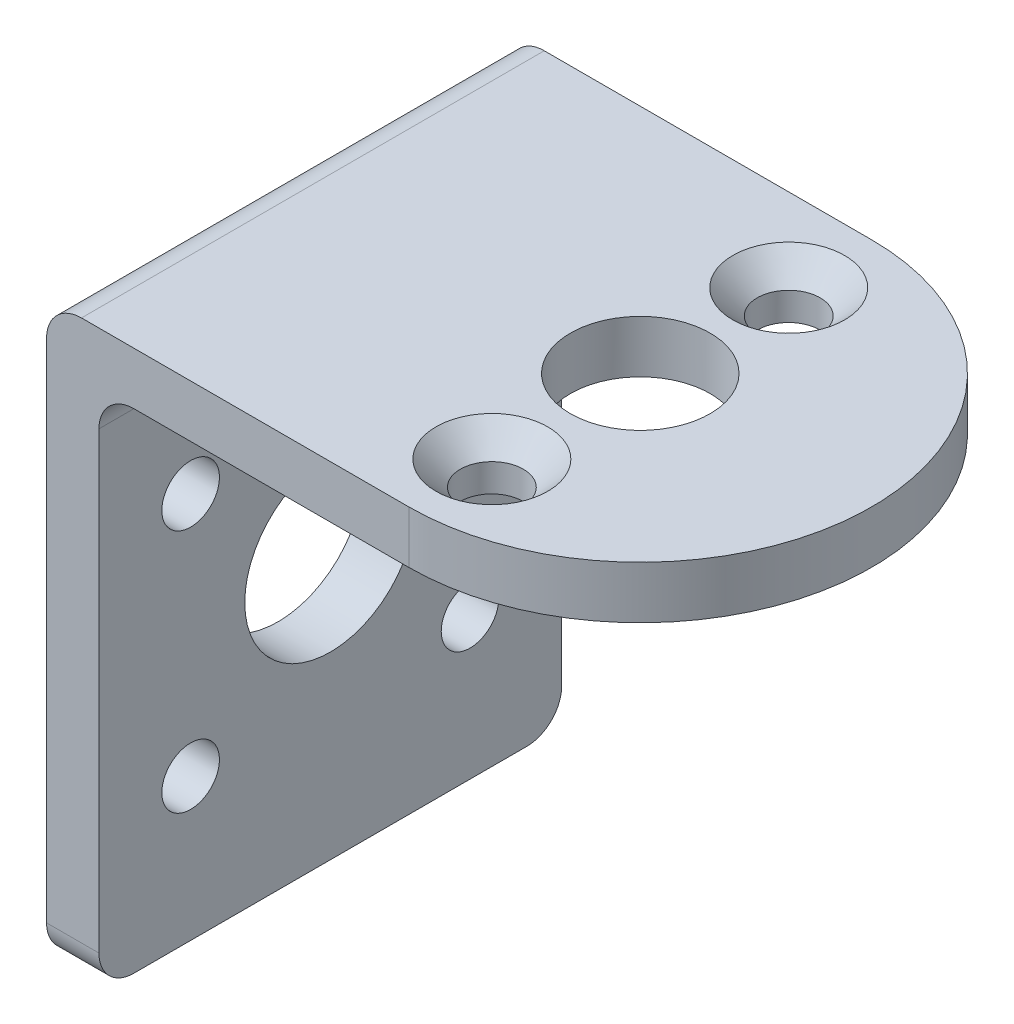
ISO-10303-21;
HEADER;
FILE_DESCRIPTION(('STEP AP214'),'2;1');
FILE_NAME('part.step','',(''),(''),'','','');
FILE_SCHEMA(('AUTOMOTIVE_DESIGN { 1 0 10303 214 1 1 1 1 }'));
ENDSEC;
DATA;
#1=APPLICATION_CONTEXT('core data for automotive mechanical design processes');
#2=APPLICATION_PROTOCOL_DEFINITION('international standard','automotive_design',2000,#1);
#3=PRODUCT_CONTEXT('',#1,'mechanical');
#4=PRODUCT('Part','Part','',(#3));
#5=PRODUCT_RELATED_PRODUCT_CATEGORY('part','',(#4));
#6=PRODUCT_DEFINITION_FORMATION('','',#4);
#7=PRODUCT_DEFINITION_CONTEXT('part definition',#1,'design');
#8=PRODUCT_DEFINITION('design','',#6,#7);
#9=PRODUCT_DEFINITION_SHAPE('','',#8);
#10=(LENGTH_UNIT() NAMED_UNIT(*) SI_UNIT(.MILLI.,.METRE.));
#11=(NAMED_UNIT(*) PLANE_ANGLE_UNIT() SI_UNIT($,.RADIAN.));
#12=(NAMED_UNIT(*) SI_UNIT($,.STERADIAN.) SOLID_ANGLE_UNIT());
#13=UNCERTAINTY_MEASURE_WITH_UNIT(LENGTH_MEASURE(1.E-05),#10,'distance_accuracy_value','');
#14=(GEOMETRIC_REPRESENTATION_CONTEXT(3) GLOBAL_UNCERTAINTY_ASSIGNED_CONTEXT((#13)) GLOBAL_UNIT_ASSIGNED_CONTEXT((#10,
#11,#12)) REPRESENTATION_CONTEXT('',''));
#15=CARTESIAN_POINT('',(0.,0.,0.));
#16=DIRECTION('',(0.,0.,1.));
#17=DIRECTION('',(1.,0.,0.));
#18=AXIS2_PLACEMENT_3D('',#15,#16,#17);
#19=CARTESIAN_POINT('',(5.,-5.,13.25));
#20=DIRECTION('',(0.,0.,-1.));
#21=DIRECTION('',(-1.,0.,0.));
#22=AXIS2_PLACEMENT_3D('',#19,#20,#21);
#23=CYLINDRICAL_SURFACE('',#22,2.);
#24=CARTESIAN_POINT('',(5.,-5.,-13.25));
#25=DIRECTION('',(0.,0.,-1.));
#26=DIRECTION('',(-1.,0.,0.));
#27=AXIS2_PLACEMENT_3D('',#24,#25,#26);
#28=CIRCLE('',#27,2.);
#29=CARTESIAN_POINT('',(3.,-5.,-13.25));
#30=VERTEX_POINT('',#29);
#31=CARTESIAN_POINT('',(5.,-3.,-13.25));
#32=VERTEX_POINT('',#31);
#33=EDGE_CURVE('E153',#30,#32,#28,.T.);
#34=ORIENTED_EDGE('',*,*,#33,.T.);
#35=DIRECTION('',(0.,0.,-1.));
#36=VECTOR('',#35,1.);
#37=CARTESIAN_POINT('',(5.,-3.,13.25));
#38=LINE('',#37,#36);
#39=CARTESIAN_POINT('',(5.,-3.,13.25));
#40=VERTEX_POINT('',#39);
#41=EDGE_CURVE('E179',#40,#32,#38,.T.);
#42=ORIENTED_EDGE('',*,*,#41,.F.);
#43=CARTESIAN_POINT('',(5.,-5.,13.25));
#44=DIRECTION('',(0.,0.,-1.));
#45=DIRECTION('',(-1.,0.,0.));
#46=AXIS2_PLACEMENT_3D('',#43,#44,#45);
#47=CIRCLE('',#46,2.);
#48=CARTESIAN_POINT('',(3.,-5.,13.25));
#49=VERTEX_POINT('',#48);
#50=EDGE_CURVE('E136',#49,#40,#47,.T.);
#51=ORIENTED_EDGE('',*,*,#50,.F.);
#52=DIRECTION('',(0.,0.,-1.));
#53=VECTOR('',#52,1.);
#54=CARTESIAN_POINT('',(3.,-5.,13.25));
#55=LINE('',#54,#53);
#56=EDGE_CURVE('E152',#49,#30,#55,.T.);
#57=ORIENTED_EDGE('',*,*,#56,.T.);
#58=EDGE_LOOP('',(#34,#42,#51,#57));
#59=FACE_BOUND('',#58,.T.);
#60=ADVANCED_FACE('F33',(#59),#23,.F.);
#61=CARTESIAN_POINT('',(5.,-3.,13.25));
#62=DIRECTION('',(0.,1.,0.));
#63=DIRECTION('',(-1.,0.,0.));
#64=AXIS2_PLACEMENT_3D('',#61,#62,#63);
#65=PLANE('',#64);
#66=CARTESIAN_POINT('',(20.75,-3.,-8.5));
#67=DIRECTION('',(0.,1.,0.));
#68=DIRECTION('',(-1.,0.,0.));
#69=AXIS2_PLACEMENT_3D('',#66,#67,#68);
#70=CIRCLE('',#69,1.79999999999999);
#71=CARTESIAN_POINT('',(18.95,-3.,-8.5));
#72=VERTEX_POINT('',#71);
#73=EDGE_CURVE('E37',#72,#72,#70,.T.);
#74=ORIENTED_EDGE('',*,*,#73,.T.);
#75=EDGE_LOOP('',(#74));
#76=FACE_BOUND('',#75,.T.);
#77=CARTESIAN_POINT('',(20.75,-3.,8.5));
#78=DIRECTION('',(0.,1.,0.));
#79=DIRECTION('',(-1.,0.,0.));
#80=AXIS2_PLACEMENT_3D('',#77,#78,#79);
#81=CIRCLE('',#80,1.8);
#82=CARTESIAN_POINT('',(18.95,-3.,8.5));
#83=VERTEX_POINT('',#82);
#84=EDGE_CURVE('E213',#83,#83,#81,.T.);
#85=ORIENTED_EDGE('',*,*,#84,.T.);
#86=EDGE_LOOP('',(#85));
#87=FACE_BOUND('',#86,.T.);
#88=CARTESIAN_POINT('',(20.75,-3.,0.));
#89=DIRECTION('',(0.,1.,0.));
#90=DIRECTION('',(-1.,0.,0.));
#91=AXIS2_PLACEMENT_3D('',#88,#89,#90);
#92=CIRCLE('',#91,4.);
#93=CARTESIAN_POINT('',(16.75,-3.,0.));
#94=VERTEX_POINT('',#93);
#95=EDGE_CURVE('E220',#94,#94,#92,.T.);
#96=ORIENTED_EDGE('',*,*,#95,.T.);
#97=EDGE_LOOP('',(#96));
#98=FACE_BOUND('',#97,.T.);
#99=DIRECTION('',(1.,0.,0.));
#100=VECTOR('',#99,1.);
#101=CARTESIAN_POINT('',(5.,-3.,-13.25));
#102=LINE('',#101,#100);
#103=CARTESIAN_POINT('',(20.75,-3.,-13.25));
#104=VERTEX_POINT('',#103);
#105=EDGE_CURVE('E131',#32,#104,#102,.T.);
#106=ORIENTED_EDGE('',*,*,#105,.T.);
#107=CARTESIAN_POINT('',(20.75,-3.,0.));
#108=DIRECTION('',(0.,1.,0.));
#109=DIRECTION('',(0.,0.,1.));
#110=AXIS2_PLACEMENT_3D('',#107,#108,#109);
#111=CIRCLE('',#110,13.25);
#112=CARTESIAN_POINT('',(20.75,-3.,13.25));
#113=VERTEX_POINT('',#112);
#114=EDGE_CURVE('E116',#113,#104,#111,.T.);
#115=ORIENTED_EDGE('',*,*,#114,.F.);
#116=DIRECTION('',(1.,0.,0.));
#117=VECTOR('',#116,1.);
#118=CARTESIAN_POINT('',(5.,-3.,13.25));
#119=LINE('',#118,#117);
#120=EDGE_CURVE('E129',#40,#113,#119,.T.);
#121=ORIENTED_EDGE('',*,*,#120,.F.);
#122=ORIENTED_EDGE('',*,*,#41,.T.);
#123=EDGE_LOOP('',(#106,#115,#121,#122));
#124=FACE_BOUND('',#123,.T.);
#125=ADVANCED_FACE('F127',(#76,#87,#98,#124),#65,.F.);
#126=CARTESIAN_POINT('',(2.00000000000001,0.,13.25));
#127=DIRECTION('',(0.,1.,0.));
#128=DIRECTION('',(0.,0.,1.));
#129=AXIS2_PLACEMENT_3D('',#126,#127,#128);
#130=PLANE('',#129);
#131=CARTESIAN_POINT('',(20.75,0.,-8.5));
#132=DIRECTION('',(0.,1.,0.));
#133=DIRECTION('',(0.,0.,1.));
#134=AXIS2_PLACEMENT_3D('',#131,#132,#133);
#135=CIRCLE('',#134,3.2);
#136=CARTESIAN_POINT('',(20.75,0.,-5.3));
#137=VERTEX_POINT('',#136);
#138=EDGE_CURVE('E472',#137,#137,#135,.T.);
#139=ORIENTED_EDGE('',*,*,#138,.F.);
#140=EDGE_LOOP('',(#139));
#141=FACE_BOUND('',#140,.T.);
#142=CARTESIAN_POINT('',(20.75,0.,8.5));
#143=DIRECTION('',(0.,1.,0.));
#144=DIRECTION('',(0.,0.,1.));
#145=AXIS2_PLACEMENT_3D('',#142,#143,#144);
#146=CIRCLE('',#145,3.2);
#147=CARTESIAN_POINT('',(20.75,0.,11.7));
#148=VERTEX_POINT('',#147);
#149=EDGE_CURVE('E223',#148,#148,#146,.T.);
#150=ORIENTED_EDGE('',*,*,#149,.F.);
#151=EDGE_LOOP('',(#150));
#152=FACE_BOUND('',#151,.T.);
#153=CARTESIAN_POINT('',(20.75,0.,0.));
#154=DIRECTION('',(0.,1.,0.));
#155=DIRECTION('',(0.,0.,1.));
#156=AXIS2_PLACEMENT_3D('',#153,#154,#155);
#157=CIRCLE('',#156,4.);
#158=CARTESIAN_POINT('',(20.75,0.,4.));
#159=VERTEX_POINT('',#158);
#160=EDGE_CURVE('E215',#159,#159,#157,.T.);
#161=ORIENTED_EDGE('',*,*,#160,.F.);
#162=EDGE_LOOP('',(#161));
#163=FACE_BOUND('',#162,.T.);
#164=CARTESIAN_POINT('',(20.75,0.,0.));
#165=DIRECTION('',(0.,1.,0.));
#166=DIRECTION('',(0.,0.,1.));
#167=AXIS2_PLACEMENT_3D('',#164,#165,#166);
#168=CIRCLE('',#167,13.25);
#169=CARTESIAN_POINT('',(20.75,0.,-13.25));
#170=VERTEX_POINT('',#169);
#171=CARTESIAN_POINT('',(20.75,0.,13.25));
#172=VERTEX_POINT('',#171);
#173=EDGE_CURVE('E119',#170,#172,#168,.F.);
#174=ORIENTED_EDGE('',*,*,#173,.F.);
#175=DIRECTION('',(1.,0.,0.));
#176=VECTOR('',#175,1.);
#177=CARTESIAN_POINT('',(2.00000000000001,0.,-13.25));
#178=LINE('',#177,#176);
#179=CARTESIAN_POINT('',(2.00000000000001,0.,-13.25));
#180=VERTEX_POINT('',#179);
#181=EDGE_CURVE('E157',#180,#170,#178,.T.);
#182=ORIENTED_EDGE('',*,*,#181,.F.);
#183=DIRECTION('',(0.,0.,-1.));
#184=VECTOR('',#183,1.);
#185=CARTESIAN_POINT('',(2.00000000000001,0.,13.25));
#186=LINE('',#185,#184);
#187=CARTESIAN_POINT('',(2.00000000000001,0.,13.25));
#188=VERTEX_POINT('',#187);
#189=EDGE_CURVE('E177',#188,#180,#186,.T.);
#190=ORIENTED_EDGE('',*,*,#189,.F.);
#191=DIRECTION('',(1.,0.,0.));
#192=VECTOR('',#191,1.);
#193=CARTESIAN_POINT('',(2.00000000000001,0.,13.25));
#194=LINE('',#193,#192);
#195=EDGE_CURVE('E138',#188,#172,#194,.T.);
#196=ORIENTED_EDGE('',*,*,#195,.T.);
#197=EDGE_LOOP('',(#174,#182,#190,#196));
#198=FACE_BOUND('',#197,.T.);
#199=ADVANCED_FACE('F273',(#141,#152,#163,#198),#130,.T.);
#200=CARTESIAN_POINT('',(2.,-2.,13.25));
#201=DIRECTION('',(0.,0.,-1.));
#202=DIRECTION('',(-1.,0.,0.));
#203=AXIS2_PLACEMENT_3D('',#200,#201,#202);
#204=CYLINDRICAL_SURFACE('',#203,2.);
#205=CARTESIAN_POINT('',(2.,-2.,-13.25));
#206=DIRECTION('',(0.,0.,-1.));
#207=DIRECTION('',(-1.,0.,0.));
#208=AXIS2_PLACEMENT_3D('',#205,#206,#207);
#209=CIRCLE('',#208,2.);
#210=CARTESIAN_POINT('',(0.,-2.00000000000001,-13.25));
#211=VERTEX_POINT('',#210);
#212=EDGE_CURVE('E160',#211,#180,#209,.T.);
#213=ORIENTED_EDGE('',*,*,#212,.F.);
#214=DIRECTION('',(0.,0.,-1.));
#215=VECTOR('',#214,1.);
#216=CARTESIAN_POINT('',(0.,-2.00000000000001,13.25));
#217=LINE('',#216,#215);
#218=CARTESIAN_POINT('',(0.,-2.00000000000001,13.25));
#219=VERTEX_POINT('',#218);
#220=EDGE_CURVE('E174',#219,#211,#217,.T.);
#221=ORIENTED_EDGE('',*,*,#220,.F.);
#222=CARTESIAN_POINT('',(2.,-2.,13.25));
#223=DIRECTION('',(0.,0.,-1.));
#224=DIRECTION('',(-1.,0.,0.));
#225=AXIS2_PLACEMENT_3D('',#222,#223,#224);
#226=CIRCLE('',#225,2.);
#227=EDGE_CURVE('E140',#219,#188,#226,.T.);
#228=ORIENTED_EDGE('',*,*,#227,.T.);
#229=ORIENTED_EDGE('',*,*,#189,.T.);
#230=EDGE_LOOP('',(#213,#221,#228,#229));
#231=FACE_BOUND('',#230,.T.);
#232=ADVANCED_FACE('F250',(#231),#204,.T.);
#233=CARTESIAN_POINT('',(0.,-33.,13.25));
#234=DIRECTION('',(-1.,0.,0.));
#235=DIRECTION('',(0.,0.,1.));
#236=AXIS2_PLACEMENT_3D('',#233,#234,#235);
#237=PLANE('',#236);
#238=CARTESIAN_POINT('',(0.,-17.8,0.));
#239=DIRECTION('',(-1.,0.,0.));
#240=DIRECTION('',(0.,0.,1.));
#241=AXIS2_PLACEMENT_3D('',#238,#239,#240);
#242=CIRCLE('',#241,4.9);
#243=CARTESIAN_POINT('',(0.,-17.8,4.9));
#244=VERTEX_POINT('',#243);
#245=EDGE_CURVE('E202',#244,#244,#242,.T.);
#246=ORIENTED_EDGE('',*,*,#245,.F.);
#247=EDGE_LOOP('',(#246));
#248=FACE_BOUND('',#247,.T.);
#249=CARTESIAN_POINT('',(0.,-10.85,-8.));
#250=DIRECTION('',(-1.,0.,0.));
#251=DIRECTION('',(0.,0.,-1.));
#252=AXIS2_PLACEMENT_3D('',#249,#250,#251);
#253=CIRCLE('',#252,1.65);
#254=CARTESIAN_POINT('',(0.,-10.85,-9.65));
#255=VERTEX_POINT('',#254);
#256=EDGE_CURVE('E198',#255,#255,#253,.T.);
#257=ORIENTED_EDGE('',*,*,#256,.F.);
#258=EDGE_LOOP('',(#257));
#259=FACE_BOUND('',#258,.T.);
#260=CARTESIAN_POINT('',(0.,-24.85,-8.));
#261=DIRECTION('',(-1.,0.,0.));
#262=DIRECTION('',(0.,0.,-1.));
#263=AXIS2_PLACEMENT_3D('',#260,#261,#262);
#264=CIRCLE('',#263,1.65);
#265=CARTESIAN_POINT('',(0.,-24.85,-9.65));
#266=VERTEX_POINT('',#265);
#267=EDGE_CURVE('E194',#266,#266,#264,.T.);
#268=ORIENTED_EDGE('',*,*,#267,.F.);
#269=EDGE_LOOP('',(#268));
#270=FACE_BOUND('',#269,.T.);
#271=CARTESIAN_POINT('',(0.,-24.85,8.));
#272=DIRECTION('',(-1.,0.,0.));
#273=DIRECTION('',(0.,0.,1.));
#274=AXIS2_PLACEMENT_3D('',#271,#272,#273);
#275=CIRCLE('',#274,1.65);
#276=CARTESIAN_POINT('',(0.,-24.85,9.65));
#277=VERTEX_POINT('',#276);
#278=EDGE_CURVE('E190',#277,#277,#275,.T.);
#279=ORIENTED_EDGE('',*,*,#278,.F.);
#280=EDGE_LOOP('',(#279));
#281=FACE_BOUND('',#280,.T.);
#282=CARTESIAN_POINT('',(0.,-10.85,8.));
#283=DIRECTION('',(-1.,0.,0.));
#284=DIRECTION('',(0.,0.,1.));
#285=AXIS2_PLACEMENT_3D('',#282,#283,#284);
#286=CIRCLE('',#285,1.65);
#287=CARTESIAN_POINT('',(0.,-10.85,9.65));
#288=VERTEX_POINT('',#287);
#289=EDGE_CURVE('E186',#288,#288,#286,.T.);
#290=ORIENTED_EDGE('',*,*,#289,.F.);
#291=EDGE_LOOP('',(#290));
#292=FACE_BOUND('',#291,.T.);
#293=DIRECTION('',(0.,1.,0.));
#294=VECTOR('',#293,1.);
#295=CARTESIAN_POINT('',(0.,-33.,-13.25));
#296=LINE('',#295,#294);
#297=CARTESIAN_POINT('',(0.,-31.,-13.25));
#298=VERTEX_POINT('',#297);
#299=EDGE_CURVE('E163',#298,#211,#296,.T.);
#300=ORIENTED_EDGE('',*,*,#299,.F.);
#301=CARTESIAN_POINT('',(0.,-31.,-11.25));
#302=DIRECTION('',(-1.,0.,0.));
#303=DIRECTION('',(0.,0.,1.));
#304=AXIS2_PLACEMENT_3D('',#301,#302,#303);
#305=CIRCLE('',#304,2.);
#306=CARTESIAN_POINT('',(0.,-33.,-11.25));
#307=VERTEX_POINT('',#306);
#308=EDGE_CURVE('E42',#298,#307,#305,.T.);
#309=ORIENTED_EDGE('',*,*,#308,.T.);
#310=DIRECTION('',(0.,0.,-1.));
#311=VECTOR('',#310,1.);
#312=CARTESIAN_POINT('',(0.,-33.,13.25));
#313=LINE('',#312,#311);
#314=CARTESIAN_POINT('',(0.,-33.,11.25));
#315=VERTEX_POINT('',#314);
#316=EDGE_CURVE('E171',#315,#307,#313,.T.);
#317=ORIENTED_EDGE('',*,*,#316,.F.);
#318=CARTESIAN_POINT('',(0.,-31.,11.25));
#319=DIRECTION('',(-1.,0.,0.));
#320=DIRECTION('',(0.,0.,1.));
#321=AXIS2_PLACEMENT_3D('',#318,#319,#320);
#322=CIRCLE('',#321,2.);
#323=CARTESIAN_POINT('',(0.,-31.,13.25));
#324=VERTEX_POINT('',#323);
#325=EDGE_CURVE('E50',#315,#324,#322,.T.);
#326=ORIENTED_EDGE('',*,*,#325,.T.);
#327=DIRECTION('',(0.,1.,0.));
#328=VECTOR('',#327,1.);
#329=CARTESIAN_POINT('',(0.,-33.,13.25));
#330=LINE('',#329,#328);
#331=EDGE_CURVE('E148',#324,#219,#330,.T.);
#332=ORIENTED_EDGE('',*,*,#331,.T.);
#333=ORIENTED_EDGE('',*,*,#220,.T.);
#334=EDGE_LOOP('',(#300,#309,#317,#326,#332,#333));
#335=FACE_BOUND('',#334,.T.);
#336=ADVANCED_FACE('F247',(#248,#259,#270,#281,#292,#335),#237,.T.);
#337=CARTESIAN_POINT('',(0.,-33.,13.25));
#338=DIRECTION('',(0.,1.,0.));
#339=DIRECTION('',(0.,0.,1.));
#340=AXIS2_PLACEMENT_3D('',#337,#338,#339);
#341=PLANE('',#340);
#342=ORIENTED_EDGE('',*,*,#316,.T.);
#343=DIRECTION('',(1.,0.,0.));
#344=VECTOR('',#343,1.);
#345=CARTESIAN_POINT('',(3.,-33.,-11.25));
#346=LINE('',#345,#344);
#347=CARTESIAN_POINT('',(3.,-33.,-11.25));
#348=VERTEX_POINT('',#347);
#349=EDGE_CURVE('E204',#307,#348,#346,.T.);
#350=ORIENTED_EDGE('',*,*,#349,.T.);
#351=DIRECTION('',(0.,0.,-1.));
#352=VECTOR('',#351,1.);
#353=CARTESIAN_POINT('',(3.,-33.,13.25));
#354=LINE('',#353,#352);
#355=CARTESIAN_POINT('',(3.,-33.,11.25));
#356=VERTEX_POINT('',#355);
#357=EDGE_CURVE('E168',#356,#348,#354,.T.);
#358=ORIENTED_EDGE('',*,*,#357,.F.);
#359=DIRECTION('',(1.,0.,0.));
#360=VECTOR('',#359,1.);
#361=CARTESIAN_POINT('',(0.,-33.,11.25));
#362=LINE('',#361,#360);
#363=EDGE_CURVE('E183',#356,#315,#362,.F.);
#364=ORIENTED_EDGE('',*,*,#363,.T.);
#365=EDGE_LOOP('',(#342,#350,#358,#364));
#366=FACE_BOUND('',#365,.T.);
#367=ADVANCED_FACE('F249',(#366),#341,.F.);
#368=CARTESIAN_POINT('',(3.,-33.,13.25));
#369=DIRECTION('',(-1.,0.,0.));
#370=DIRECTION('',(0.,0.,1.));
#371=AXIS2_PLACEMENT_3D('',#368,#369,#370);
#372=PLANE('',#371);
#373=CARTESIAN_POINT('',(3.,-17.8,0.));
#374=DIRECTION('',(-1.,0.,0.));
#375=DIRECTION('',(0.,0.,1.));
#376=AXIS2_PLACEMENT_3D('',#373,#374,#375);
#377=CIRCLE('',#376,4.9);
#378=CARTESIAN_POINT('',(3.,-17.8,4.9));
#379=VERTEX_POINT('',#378);
#380=EDGE_CURVE('E199',#379,#379,#377,.T.);
#381=ORIENTED_EDGE('',*,*,#380,.T.);
#382=EDGE_LOOP('',(#381));
#383=FACE_BOUND('',#382,.T.);
#384=CARTESIAN_POINT('',(3.,-10.85,-8.));
#385=DIRECTION('',(-1.,0.,0.));
#386=DIRECTION('',(0.,0.,1.));
#387=AXIS2_PLACEMENT_3D('',#384,#385,#386);
#388=CIRCLE('',#387,1.65);
#389=CARTESIAN_POINT('',(3.,-10.85,-6.35));
#390=VERTEX_POINT('',#389);
#391=EDGE_CURVE('E195',#390,#390,#388,.T.);
#392=ORIENTED_EDGE('',*,*,#391,.T.);
#393=EDGE_LOOP('',(#392));
#394=FACE_BOUND('',#393,.T.);
#395=CARTESIAN_POINT('',(3.,-24.85,-8.));
#396=DIRECTION('',(-1.,0.,0.));
#397=DIRECTION('',(0.,0.,1.));
#398=AXIS2_PLACEMENT_3D('',#395,#396,#397);
#399=CIRCLE('',#398,1.65);
#400=CARTESIAN_POINT('',(3.,-24.85,-6.35));
#401=VERTEX_POINT('',#400);
#402=EDGE_CURVE('E191',#401,#401,#399,.T.);
#403=ORIENTED_EDGE('',*,*,#402,.T.);
#404=EDGE_LOOP('',(#403));
#405=FACE_BOUND('',#404,.T.);
#406=CARTESIAN_POINT('',(3.,-24.85,8.));
#407=DIRECTION('',(-1.,0.,0.));
#408=DIRECTION('',(0.,0.,1.));
#409=AXIS2_PLACEMENT_3D('',#406,#407,#408);
#410=CIRCLE('',#409,1.65);
#411=CARTESIAN_POINT('',(3.,-24.85,9.65));
#412=VERTEX_POINT('',#411);
#413=EDGE_CURVE('E187',#412,#412,#410,.T.);
#414=ORIENTED_EDGE('',*,*,#413,.T.);
#415=EDGE_LOOP('',(#414));
#416=FACE_BOUND('',#415,.T.);
#417=CARTESIAN_POINT('',(3.,-10.85,8.));
#418=DIRECTION('',(-1.,0.,0.));
#419=DIRECTION('',(0.,0.,1.));
#420=AXIS2_PLACEMENT_3D('',#417,#418,#419);
#421=CIRCLE('',#420,1.65);
#422=CARTESIAN_POINT('',(3.,-10.85,9.65));
#423=VERTEX_POINT('',#422);
#424=EDGE_CURVE('E132',#423,#423,#421,.T.);
#425=ORIENTED_EDGE('',*,*,#424,.T.);
#426=EDGE_LOOP('',(#425));
#427=FACE_BOUND('',#426,.T.);
#428=ORIENTED_EDGE('',*,*,#357,.T.);
#429=CARTESIAN_POINT('',(3.,-31.,-11.25));
#430=DIRECTION('',(-1.,0.,0.));
#431=DIRECTION('',(0.,0.,1.));
#432=AXIS2_PLACEMENT_3D('',#429,#430,#431);
#433=CIRCLE('',#432,2.);
#434=CARTESIAN_POINT('',(3.,-31.,-13.25));
#435=VERTEX_POINT('',#434);
#436=EDGE_CURVE('E209',#348,#435,#433,.F.);
#437=ORIENTED_EDGE('',*,*,#436,.T.);
#438=DIRECTION('',(0.,1.,0.));
#439=VECTOR('',#438,1.);
#440=CARTESIAN_POINT('',(3.,-33.,-13.25));
#441=LINE('',#440,#439);
#442=EDGE_CURVE('E142',#435,#30,#441,.T.);
#443=ORIENTED_EDGE('',*,*,#442,.T.);
#444=ORIENTED_EDGE('',*,*,#56,.F.);
#445=DIRECTION('',(0.,1.,0.));
#446=VECTOR('',#445,1.);
#447=CARTESIAN_POINT('',(3.,-33.,13.25));
#448=LINE('',#447,#446);
#449=CARTESIAN_POINT('',(3.,-31.,13.25));
#450=VERTEX_POINT('',#449);
#451=EDGE_CURVE('E150',#450,#49,#448,.T.);
#452=ORIENTED_EDGE('',*,*,#451,.F.);
#453=CARTESIAN_POINT('',(3.,-31.,11.25));
#454=DIRECTION('',(-1.,0.,0.));
#455=DIRECTION('',(0.,0.,1.));
#456=AXIS2_PLACEMENT_3D('',#453,#454,#455);
#457=CIRCLE('',#456,2.);
#458=EDGE_CURVE('E207',#450,#356,#457,.F.);
#459=ORIENTED_EDGE('',*,*,#458,.T.);
#460=EDGE_LOOP('',(#428,#437,#443,#444,#452,#459));
#461=FACE_BOUND('',#460,.T.);
#462=ADVANCED_FACE('F263',(#383,#394,#405,#416,#427,#461),#372,.F.);
#463=CARTESIAN_POINT('',(5.,-5.,13.25));
#464=DIRECTION('',(0.,0.,-1.));
#465=DIRECTION('',(-1.,0.,0.));
#466=AXIS2_PLACEMENT_3D('',#463,#464,#465);
#467=PLANE('',#466);
#468=ORIENTED_EDGE('',*,*,#331,.F.);
#469=DIRECTION('',(1.,0.,0.));
#470=VECTOR('',#469,1.);
#471=CARTESIAN_POINT('',(5.,-31.,13.25));
#472=LINE('',#471,#470);
#473=EDGE_CURVE('E11',#324,#450,#472,.T.);
#474=ORIENTED_EDGE('',*,*,#473,.T.);
#475=ORIENTED_EDGE('',*,*,#451,.T.);
#476=ORIENTED_EDGE('',*,*,#50,.T.);
#477=ORIENTED_EDGE('',*,*,#120,.T.);
#478=DIRECTION('',(0.,-1.,0.));
#479=VECTOR('',#478,1.);
#480=CARTESIAN_POINT('',(20.75,37.,13.25));
#481=LINE('',#480,#479);
#482=EDGE_CURVE('E113',#172,#113,#481,.T.);
#483=ORIENTED_EDGE('',*,*,#482,.F.);
#484=ORIENTED_EDGE('',*,*,#195,.F.);
#485=ORIENTED_EDGE('',*,*,#227,.F.);
#486=EDGE_LOOP('',(#468,#474,#475,#476,#477,#483,#484,#485));
#487=FACE_BOUND('',#486,.T.);
#488=ADVANCED_FACE('F134',(#487),#467,.F.);
#489=CARTESIAN_POINT('',(5.,-5.,-13.25));
#490=DIRECTION('',(0.,0.,-1.));
#491=DIRECTION('',(-1.,0.,0.));
#492=AXIS2_PLACEMENT_3D('',#489,#490,#491);
#493=PLANE('',#492);
#494=ORIENTED_EDGE('',*,*,#442,.F.);
#495=DIRECTION('',(1.,0.,0.));
#496=VECTOR('',#495,1.);
#497=CARTESIAN_POINT('',(0.,-31.,-13.25));
#498=LINE('',#497,#496);
#499=EDGE_CURVE('E58',#435,#298,#498,.F.);
#500=ORIENTED_EDGE('',*,*,#499,.T.);
#501=ORIENTED_EDGE('',*,*,#299,.T.);
#502=ORIENTED_EDGE('',*,*,#212,.T.);
#503=ORIENTED_EDGE('',*,*,#181,.T.);
#504=DIRECTION('',(0.,-1.,0.));
#505=VECTOR('',#504,1.);
#506=CARTESIAN_POINT('',(20.75,37.,-13.25));
#507=LINE('',#506,#505);
#508=EDGE_CURVE('E181',#104,#170,#507,.F.);
#509=ORIENTED_EDGE('',*,*,#508,.F.);
#510=ORIENTED_EDGE('',*,*,#105,.F.);
#511=ORIENTED_EDGE('',*,*,#33,.F.);
#512=EDGE_LOOP('',(#494,#500,#501,#502,#503,#509,#510,#511));
#513=FACE_BOUND('',#512,.T.);
#514=ADVANCED_FACE('F271',(#513),#493,.T.);
#515=CARTESIAN_POINT('',(20.75,37.,0.));
#516=DIRECTION('',(0.,-1.,0.));
#517=DIRECTION('',(0.,0.,-1.));
#518=AXIS2_PLACEMENT_3D('',#515,#516,#517);
#519=CYLINDRICAL_SURFACE('',#518,13.25);
#520=ORIENTED_EDGE('',*,*,#173,.T.);
#521=ORIENTED_EDGE('',*,*,#482,.T.);
#522=ORIENTED_EDGE('',*,*,#114,.T.);
#523=ORIENTED_EDGE('',*,*,#508,.T.);
#524=EDGE_LOOP('',(#520,#521,#522,#523));
#525=FACE_BOUND('',#524,.T.);
#526=ADVANCED_FACE('F115',(#525),#519,.T.);
#527=CARTESIAN_POINT('',(40.,-10.85,8.));
#528=DIRECTION('',(-1.,0.,0.));
#529=DIRECTION('',(0.,0.,1.));
#530=AXIS2_PLACEMENT_3D('',#527,#528,#529);
#531=CYLINDRICAL_SURFACE('',#530,1.65);
#532=ORIENTED_EDGE('',*,*,#289,.T.);
#533=EDGE_LOOP('',(#532));
#534=FACE_BOUND('',#533,.T.);
#535=ORIENTED_EDGE('',*,*,#424,.F.);
#536=EDGE_LOOP('',(#535));
#537=FACE_BOUND('',#536,.T.);
#538=ADVANCED_FACE('F244',(#534,#537),#531,.F.);
#539=CARTESIAN_POINT('',(40.,-24.85,8.));
#540=DIRECTION('',(-1.,0.,0.));
#541=DIRECTION('',(0.,0.,1.));
#542=AXIS2_PLACEMENT_3D('',#539,#540,#541);
#543=CYLINDRICAL_SURFACE('',#542,1.65);
#544=ORIENTED_EDGE('',*,*,#278,.T.);
#545=EDGE_LOOP('',(#544));
#546=FACE_BOUND('',#545,.T.);
#547=ORIENTED_EDGE('',*,*,#413,.F.);
#548=EDGE_LOOP('',(#547));
#549=FACE_BOUND('',#548,.T.);
#550=ADVANCED_FACE('F313',(#546,#549),#543,.F.);
#551=CARTESIAN_POINT('',(40.,-24.85,-8.));
#552=DIRECTION('',(-1.,0.,0.));
#553=DIRECTION('',(0.,0.,1.));
#554=AXIS2_PLACEMENT_3D('',#551,#552,#553);
#555=CYLINDRICAL_SURFACE('',#554,1.65);
#556=ORIENTED_EDGE('',*,*,#267,.T.);
#557=EDGE_LOOP('',(#556));
#558=FACE_BOUND('',#557,.T.);
#559=ORIENTED_EDGE('',*,*,#402,.F.);
#560=EDGE_LOOP('',(#559));
#561=FACE_BOUND('',#560,.T.);
#562=ADVANCED_FACE('F304',(#558,#561),#555,.F.);
#563=CARTESIAN_POINT('',(40.,-10.85,-8.));
#564=DIRECTION('',(-1.,0.,0.));
#565=DIRECTION('',(0.,0.,1.));
#566=AXIS2_PLACEMENT_3D('',#563,#564,#565);
#567=CYLINDRICAL_SURFACE('',#566,1.65);
#568=ORIENTED_EDGE('',*,*,#256,.T.);
#569=EDGE_LOOP('',(#568));
#570=FACE_BOUND('',#569,.T.);
#571=ORIENTED_EDGE('',*,*,#391,.F.);
#572=EDGE_LOOP('',(#571));
#573=FACE_BOUND('',#572,.T.);
#574=ADVANCED_FACE('F298',(#570,#573),#567,.F.);
#575=CARTESIAN_POINT('',(40.,-17.8,0.));
#576=DIRECTION('',(-1.,0.,0.));
#577=DIRECTION('',(0.,0.,1.));
#578=AXIS2_PLACEMENT_3D('',#575,#576,#577);
#579=CYLINDRICAL_SURFACE('',#578,4.9);
#580=ORIENTED_EDGE('',*,*,#245,.T.);
#581=EDGE_LOOP('',(#580));
#582=FACE_BOUND('',#581,.T.);
#583=ORIENTED_EDGE('',*,*,#380,.F.);
#584=EDGE_LOOP('',(#583));
#585=FACE_BOUND('',#584,.T.);
#586=ADVANCED_FACE('F292',(#582,#585),#579,.F.);
#587=CARTESIAN_POINT('',(0.,-31.,-11.25));
#588=DIRECTION('',(-1.,0.,0.));
#589=DIRECTION('',(0.,0.,1.));
#590=AXIS2_PLACEMENT_3D('',#587,#588,#589);
#591=CYLINDRICAL_SURFACE('',#590,2.);
#592=ORIENTED_EDGE('',*,*,#308,.F.);
#593=ORIENTED_EDGE('',*,*,#499,.F.);
#594=ORIENTED_EDGE('',*,*,#436,.F.);
#595=ORIENTED_EDGE('',*,*,#349,.F.);
#596=EDGE_LOOP('',(#592,#593,#594,#595));
#597=FACE_BOUND('',#596,.T.);
#598=ADVANCED_FACE('F258',(#597),#591,.T.);
#599=CARTESIAN_POINT('',(5.,-31.,11.25));
#600=DIRECTION('',(1.,0.,0.));
#601=DIRECTION('',(0.,0.,-1.));
#602=AXIS2_PLACEMENT_3D('',#599,#600,#601);
#603=CYLINDRICAL_SURFACE('',#602,2.);
#604=ORIENTED_EDGE('',*,*,#325,.F.);
#605=ORIENTED_EDGE('',*,*,#363,.F.);
#606=ORIENTED_EDGE('',*,*,#458,.F.);
#607=ORIENTED_EDGE('',*,*,#473,.F.);
#608=EDGE_LOOP('',(#604,#605,#606,#607));
#609=FACE_BOUND('',#608,.T.);
#610=ADVANCED_FACE('F35',(#609),#603,.T.);
#611=CARTESIAN_POINT('',(20.75,-10.,0.));
#612=DIRECTION('',(0.,1.,0.));
#613=DIRECTION('',(0.,0.,1.));
#614=AXIS2_PLACEMENT_3D('',#611,#612,#613);
#615=CYLINDRICAL_SURFACE('',#614,4.);
#616=ORIENTED_EDGE('',*,*,#160,.T.);
#617=EDGE_LOOP('',(#616));
#618=FACE_BOUND('',#617,.T.);
#619=ORIENTED_EDGE('',*,*,#95,.F.);
#620=EDGE_LOOP('',(#619));
#621=FACE_BOUND('',#620,.T.);
#622=ADVANCED_FACE('F297',(#618,#621),#615,.F.);
#623=CARTESIAN_POINT('',(20.75,0.,8.5));
#624=DIRECTION('',(0.,1.,0.));
#625=DIRECTION('',(0.,0.,1.));
#626=AXIS2_PLACEMENT_3D('',#623,#624,#625);
#627=CYLINDRICAL_SURFACE('',#626,1.8);
#628=CARTESIAN_POINT('',(20.75,-1.4,8.5));
#629=DIRECTION('',(0.,1.,0.));
#630=DIRECTION('',(0.,0.,1.));
#631=AXIS2_PLACEMENT_3D('',#628,#629,#630);
#632=CIRCLE('',#631,1.8);
#633=CARTESIAN_POINT('',(20.75,-1.4,10.3));
#634=VERTEX_POINT('',#633);
#635=EDGE_CURVE('E216',#634,#634,#632,.T.);
#636=ORIENTED_EDGE('',*,*,#635,.T.);
#637=EDGE_LOOP('',(#636));
#638=FACE_BOUND('',#637,.T.);
#639=ORIENTED_EDGE('',*,*,#84,.F.);
#640=EDGE_LOOP('',(#639));
#641=FACE_BOUND('',#640,.T.);
#642=ADVANCED_FACE('F422',(#638,#641),#627,.F.);
#643=CARTESIAN_POINT('',(20.75,0.,8.5));
#644=DIRECTION('',(0.,1.,0.));
#645=DIRECTION('',(0.,0.,1.));
#646=AXIS2_PLACEMENT_3D('',#643,#644,#645);
#647=CONICAL_SURFACE('',#646,3.2,0.785398163397448);
#648=ORIENTED_EDGE('',*,*,#635,.F.);
#649=EDGE_LOOP('',(#648));
#650=FACE_BOUND('',#649,.T.);
#651=ORIENTED_EDGE('',*,*,#149,.T.);
#652=EDGE_LOOP('',(#651));
#653=FACE_BOUND('',#652,.T.);
#654=ADVANCED_FACE('F416',(#650,#653),#647,.F.);
#655=CARTESIAN_POINT('',(20.75,0.,-8.5));
#656=DIRECTION('',(0.,1.,0.));
#657=DIRECTION('',(0.,0.,1.));
#658=AXIS2_PLACEMENT_3D('',#655,#656,#657);
#659=CYLINDRICAL_SURFACE('',#658,1.79999999999999);
#660=CARTESIAN_POINT('',(20.75,-1.4,-8.5));
#661=DIRECTION('',(0.,1.,0.));
#662=DIRECTION('',(0.,0.,1.));
#663=AXIS2_PLACEMENT_3D('',#660,#661,#662);
#664=CIRCLE('',#663,1.8);
#665=CARTESIAN_POINT('',(20.75,-1.4,-6.7));
#666=VERTEX_POINT('',#665);
#667=EDGE_CURVE('E470',#666,#666,#664,.T.);
#668=ORIENTED_EDGE('',*,*,#667,.T.);
#669=EDGE_LOOP('',(#668));
#670=FACE_BOUND('',#669,.T.);
#671=ORIENTED_EDGE('',*,*,#73,.F.);
#672=EDGE_LOOP('',(#671));
#673=FACE_BOUND('',#672,.T.);
#674=ADVANCED_FACE('F421',(#670,#673),#659,.F.);
#675=CARTESIAN_POINT('',(20.75,0.,-8.5));
#676=DIRECTION('',(0.,1.,0.));
#677=DIRECTION('',(0.,0.,1.));
#678=AXIS2_PLACEMENT_3D('',#675,#676,#677);
#679=CONICAL_SURFACE('',#678,3.2,0.785398163397448);
#680=ORIENTED_EDGE('',*,*,#667,.F.);
#681=EDGE_LOOP('',(#680));
#682=FACE_BOUND('',#681,.T.);
#683=ORIENTED_EDGE('',*,*,#138,.T.);
#684=EDGE_LOOP('',(#683));
#685=FACE_BOUND('',#684,.T.);
#686=ADVANCED_FACE('F461',(#682,#685),#679,.F.);
#687=CLOSED_SHELL('',(#60,#125,#199,#232,#336,#367,#462,#488,#514,#526,#538,#550,#562,#574,#586,
#598,#610,#622,#642,#654,#674,#686));
#688=MANIFOLD_SOLID_BREP('B2',#687);
#689=ADVANCED_BREP_SHAPE_REPRESENTATION('',(#18,#688),#14);
#690=SHAPE_DEFINITION_REPRESENTATION(#9,#689);
ENDSEC;
END-ISO-10303-21;
